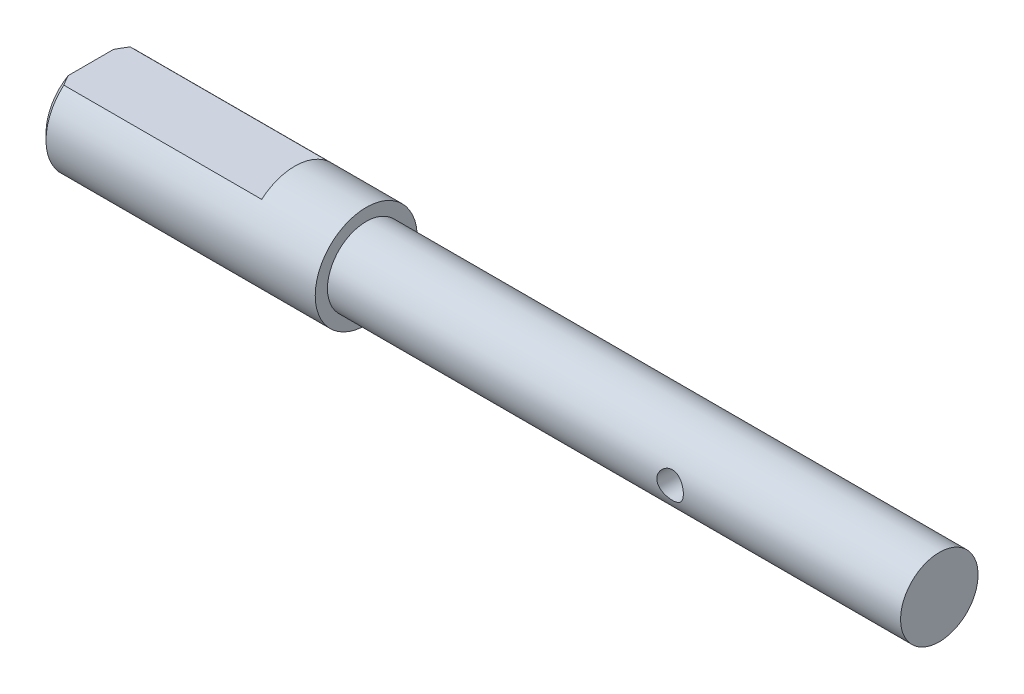
ISO-10303-21;
HEADER;
FILE_DESCRIPTION(('STEP AP214'),'2;1');
FILE_NAME('part.step','',(''),(''),'','','');
FILE_SCHEMA(('AUTOMOTIVE_DESIGN { 1 0 10303 214 1 1 1 1 }'));
ENDSEC;
DATA;
#1=APPLICATION_CONTEXT('core data for automotive mechanical design processes');
#2=APPLICATION_PROTOCOL_DEFINITION('international standard','automotive_design',2000,#1);
#3=PRODUCT_CONTEXT('',#1,'mechanical');
#4=PRODUCT('Part','Part','',(#3));
#5=PRODUCT_RELATED_PRODUCT_CATEGORY('part','',(#4));
#6=PRODUCT_DEFINITION_FORMATION('','',#4);
#7=PRODUCT_DEFINITION_CONTEXT('part definition',#1,'design');
#8=PRODUCT_DEFINITION('design','',#6,#7);
#9=PRODUCT_DEFINITION_SHAPE('','',#8);
#10=(LENGTH_UNIT() NAMED_UNIT(*) SI_UNIT(.MILLI.,.METRE.));
#11=(NAMED_UNIT(*) PLANE_ANGLE_UNIT() SI_UNIT($,.RADIAN.));
#12=(NAMED_UNIT(*) SI_UNIT($,.STERADIAN.) SOLID_ANGLE_UNIT());
#13=UNCERTAINTY_MEASURE_WITH_UNIT(LENGTH_MEASURE(1.E-05),#10,'distance_accuracy_value','');
#14=(GEOMETRIC_REPRESENTATION_CONTEXT(3) GLOBAL_UNCERTAINTY_ASSIGNED_CONTEXT((#13)) GLOBAL_UNIT_ASSIGNED_CONTEXT((#10,
#11,#12)) REPRESENTATION_CONTEXT('',''));
#15=CARTESIAN_POINT('',(0.,0.,0.));
#16=DIRECTION('',(0.,0.,1.));
#17=DIRECTION('',(1.,0.,0.));
#18=AXIS2_PLACEMENT_3D('',#15,#16,#17);
#19=CARTESIAN_POINT('',(0.,0.,0.));
#20=DIRECTION('',(-1.,0.,0.));
#21=DIRECTION('',(0.,0.,1.));
#22=AXIS2_PLACEMENT_3D('',#19,#20,#21);
#23=PLANE('',#22);
#24=CARTESIAN_POINT('',(0.,0.,0.));
#25=DIRECTION('',(-1.,0.,0.));
#26=DIRECTION('',(0.,0.,1.));
#27=AXIS2_PLACEMENT_3D('',#24,#25,#26);
#28=CIRCLE('',#27,4.826);
#29=CARTESIAN_POINT('',(0.,0.,4.826));
#30=VERTEX_POINT('',#29);
#31=EDGE_CURVE('E92',#30,#30,#28,.T.);
#32=ORIENTED_EDGE('',*,*,#31,.F.);
#33=EDGE_LOOP('',(#32));
#34=FACE_BOUND('',#33,.T.);
#35=ADVANCED_FACE('F33',(#34),#23,.F.);
#36=CARTESIAN_POINT('',(-91.2194484057398,0.,0.));
#37=DIRECTION('',(-1.,0.,0.));
#38=DIRECTION('',(0.,0.,1.));
#39=AXIS2_PLACEMENT_3D('',#36,#37,#38);
#40=CYLINDRICAL_SURFACE('',#39,4.826);
#41=CARTESIAN_POINT('',(-27.051,0.,4.826));
#42=CARTESIAN_POINT('',(-27.0509990878449,-0.089948310925937,4.82600061504766));
#43=CARTESIAN_POINT('',(-27.0583744751056,-0.179890234701643,4.82346234369505));
#44=CARTESIAN_POINT('',(-27.0875850912071,-0.357116778876718,4.81358738474251));
#45=CARTESIAN_POINT('',(-27.1094210660478,-0.444401261939741,4.80625044958703));
#46=CARTESIAN_POINT('',(-27.1667110952843,-0.61373237601587,4.78757345946431));
#47=CARTESIAN_POINT('',(-27.2021416616571,-0.695787758029834,4.77624031166481));
#48=CARTESIAN_POINT('',(-27.2855062651825,-0.852790489047824,4.75072192281067));
#49=CARTESIAN_POINT('',(-27.3334429694288,-0.92773631719387,4.73653607352901));
#50=CARTESIAN_POINT('',(-27.4422820962835,-1.07110916146627,4.7062244663646));
#51=CARTESIAN_POINT('',(-27.5035570085458,-1.13924314200904,4.69005046605606));
#52=CARTESIAN_POINT('',(-27.6365415846283,-1.26449445212582,4.65784499669713));
#53=CARTESIAN_POINT('',(-27.7082537064856,-1.32160917919808,4.64181356216832));
#54=CARTESIAN_POINT('',(-27.8627601529367,-1.42491105759758,4.61117156157241));
#55=CARTESIAN_POINT('',(-27.9458262841505,-1.47071069071595,4.59661942772964));
#56=CARTESIAN_POINT('',(-28.1190601128022,-1.54756344575182,4.57132064852932));
#57=CARTESIAN_POINT('',(-28.2092254994659,-1.57862134308965,4.56057277111275));
#58=CARTESIAN_POINT('',(-28.3907564320178,-1.62399794238702,4.54460894203585));
#59=CARTESIAN_POINT('',(-28.4819677085012,-1.63886797031299,4.53921139060835));
#60=CARTESIAN_POINT('',(-28.6657380910534,-1.65317049950624,4.53402324261601));
#61=CARTESIAN_POINT('',(-28.7582967439551,-1.65260807655792,4.53423080251107));
#62=CARTESIAN_POINT('',(-28.9373669896174,-1.63648839691122,4.5400707940568));
#63=CARTESIAN_POINT('',(-29.0239542298227,-1.62165927003447,4.54543979132206));
#64=CARTESIAN_POINT('',(-29.1933282694475,-1.57861815185369,4.56056528450964));
#65=CARTESIAN_POINT('',(-29.2761145895695,-1.55040447780873,4.57032233210131));
#66=CARTESIAN_POINT('',(-29.4371562807196,-1.48093449817667,4.59330621342633));
#67=CARTESIAN_POINT('',(-29.5153127427917,-1.43946799410487,4.60658833771117));
#68=CARTESIAN_POINT('',(-29.6637844180559,-1.34481540966014,4.6351036028836));
#69=CARTESIAN_POINT('',(-29.7340972613822,-1.29162580164328,4.65033733045655));
#70=CARTESIAN_POINT('',(-29.8689656142098,-1.17157328163229,4.6820666750574));
#71=CARTESIAN_POINT('',(-29.9329893166624,-1.1041178148428,4.69858553817464));
#72=CARTESIAN_POINT('',(-30.048958533735,-0.959226286541978,4.73029112439364));
#73=CARTESIAN_POINT('',(-30.1009027630036,-0.881789164265023,4.74547770562309));
#74=CARTESIAN_POINT('',(-30.1916974357047,-0.717958890187942,4.77302589336304));
#75=CARTESIAN_POINT('',(-30.2303984681836,-0.631477053882522,4.78535478858825));
#76=CARTESIAN_POINT('',(-30.2925355387876,-0.452706817027459,4.80556014939178));
#77=CARTESIAN_POINT('',(-30.3159771749292,-0.360420559511136,4.81343824763588));
#78=CARTESIAN_POINT('',(-30.3459718260231,-0.177158016638175,4.82358054309094));
#79=CARTESIAN_POINT('',(-30.3532429232144,-0.0863123104835725,4.82608325915506));
#80=CARTESIAN_POINT('',(-30.3527447809025,0.0953235836668608,4.82591253439317));
#81=CARTESIAN_POINT('',(-30.3449782344702,0.186113778691311,4.82324002039197));
#82=CARTESIAN_POINT('',(-30.3151894028307,0.362141478462459,4.81317669710174));
#83=CARTESIAN_POINT('',(-30.2936138184491,0.447463878135752,4.80593383153746));
#84=CARTESIAN_POINT('',(-30.2373837966749,0.613238679520882,4.78760639543958));
#85=CARTESIAN_POINT('',(-30.2027276766339,0.693690453141563,4.77652133066982));
#86=CARTESIAN_POINT('',(-30.1202852344671,0.849868179245454,4.75125571759644));
#87=CARTESIAN_POINT('',(-30.0721691419708,0.925407466689288,4.73699955710669));
#88=CARTESIAN_POINT('',(-29.964556746607,1.06756980332561,4.70700095153061));
#89=CARTESIAN_POINT('',(-29.9050568072141,1.13418999175623,4.691258032321));
#90=CARTESIAN_POINT('',(-29.7729920100712,1.25995369999455,4.65909969804483));
#91=CARTESIAN_POINT('',(-29.6999372173058,1.31858502260897,4.64268826423372));
#92=CARTESIAN_POINT('',(-29.5446776399304,1.42282719507505,4.61181134694473));
#93=CARTESIAN_POINT('',(-29.4624726584125,1.46843776465068,4.59734590535851));
#94=CARTESIAN_POINT('',(-29.2911022965889,1.54517326837327,4.57212804483025));
#95=CARTESIAN_POINT('',(-29.2019440885254,1.57631290438644,4.56137186031652));
#96=CARTESIAN_POINT('',(-29.0191923708194,1.62298264553532,4.54497823027584));
#97=CARTESIAN_POINT('',(-28.9256010249489,1.63852028529683,4.53933831409184));
#98=CARTESIAN_POINT('',(-28.7420821798439,1.6529384951282,4.53410665431848));
#99=CARTESIAN_POINT('',(-28.6522299671084,1.65267375462084,4.53420456825034));
#100=CARTESIAN_POINT('',(-28.4739226590757,1.63761572155461,4.53966446117484));
#101=CARTESIAN_POINT('',(-28.3854674723027,1.62282338428934,4.54502609404024));
#102=CARTESIAN_POINT('',(-28.2143300852495,1.57974835614155,4.56017235996656));
#103=CARTESIAN_POINT('',(-28.1315654778658,1.55175674682184,4.56986133027582));
#104=CARTESIAN_POINT('',(-27.9718461970304,1.48331722436171,4.59253082412528));
#105=CARTESIAN_POINT('',(-27.8948928600655,1.44286645663809,4.60551210186284));
#106=CARTESIAN_POINT('',(-27.7451809033666,1.34851021927541,4.63404007488274));
#107=CARTESIAN_POINT('',(-27.6727727571343,1.29407604105817,4.64967665939095));
#108=CARTESIAN_POINT('',(-27.537843087574,1.17417636692477,4.68139155639397));
#109=CARTESIAN_POINT('',(-27.4753244392811,1.10870767448248,4.69746999575438));
#110=CARTESIAN_POINT('',(-27.3593027694882,0.965308103828818,4.72906546679739));
#111=CARTESIAN_POINT('',(-27.3062869421173,0.886970153682897,4.74453079074102));
#112=CARTESIAN_POINT('',(-27.2142265932408,0.72197664784724,4.77242219831037));
#113=CARTESIAN_POINT('',(-27.1751793840624,0.635322696295829,4.78484886645178));
#114=CARTESIAN_POINT('',(-27.1132692842283,0.458546866642945,4.80496654513614));
#115=CARTESIAN_POINT('',(-27.0899965529363,0.368582563768228,4.81277674328467));
#116=CARTESIAN_POINT('',(-27.0588648029331,0.185742621781157,4.82329235134141));
#117=CARTESIAN_POINT('',(-27.0510009417623,0.0928679066329231,4.82599936498875));
#118=CARTESIAN_POINT('',(-27.051,0.,4.826));
#119=B_SPLINE_CURVE_WITH_KNOTS('',3,(#41,#42,#43,#44,#45,#46,#47,#48,#49,#50,#51,#52,#53,#54,
#55,#56,#57,#58,#59,#60,#61,#62,#63,#64,#65,#66,#67,#68,#69,#70,#71,#72,#73,#74,#75,#76,#77,#78,
#79,#80,#81,#82,#83,#84,#85,#86,#87,#88,#89,#90,#91,#92,#93,#94,#95,#96,#97,#98,#99,#100,#101,
#102,#103,#104,#105,#106,#107,#108,#109,#110,#111,#112,#113,#114,#115,#116,#117,#118),
.UNSPECIFIED.,.T.,.F.,(4,2,2,2,2,2,2,2,2,2,2,2,2,2,2,2,2,2,2,2,2,2,2,2,2,2,2,2,2,2,2,2,2,2,2,2,
2,2,4),(0.,0.269503016147321,0.539019936630532,0.80807328158337,1.07718405257586,
1.35508842028342,1.6330583426685,1.91952748427716,2.20590376397331,2.48218802140442,
2.75838140911425,3.02118753986466,3.28402672006198,3.55126085495383,3.81857551434541,
4.10064112158837,4.38273672912147,4.66791743303494,4.95299345735877,5.22513367779232,
5.49722516551677,5.76093150032747,6.0246717692468,6.29554519017895,6.56650528548132,
6.85046803103149,7.13443688851284,7.41811661130837,7.70165927151467,7.96988087121881,
8.23808483461142,8.50063255599857,8.76324047587522,9.03780411918807,9.31244743642614,
9.59859216196641,9.88468180134445,10.1630199923053,10.4412706974405),.UNSPECIFIED.);
#120=CARTESIAN_POINT('',(-27.051,0.,4.826));
#121=VERTEX_POINT('',#120);
#122=EDGE_CURVE('E89',#121,#121,#119,.T.);
#123=ORIENTED_EDGE('',*,*,#122,.T.);
#124=EDGE_LOOP('',(#123));
#125=FACE_BOUND('',#124,.T.);
#126=CARTESIAN_POINT('',(-27.051,0.,-4.826));
#127=CARTESIAN_POINT('',(-27.0509990878449,0.0899483109259372,-4.82600061504766));
#128=CARTESIAN_POINT('',(-27.0583744751056,0.179890234701644,-4.82346234369505));
#129=CARTESIAN_POINT('',(-27.0875850912071,0.357116778876719,-4.81358738474251));
#130=CARTESIAN_POINT('',(-27.1094210660478,0.444401261939741,-4.80625044958703));
#131=CARTESIAN_POINT('',(-27.1667110952843,0.61373237601587,-4.78757345946431));
#132=CARTESIAN_POINT('',(-27.2021416616571,0.695787758029834,-4.77624031166481));
#133=CARTESIAN_POINT('',(-27.2855062651825,0.852790489047824,-4.75072192281067));
#134=CARTESIAN_POINT('',(-27.3334429694288,0.92773631719387,-4.73653607352901));
#135=CARTESIAN_POINT('',(-27.4422820962835,1.07110916146627,-4.7062244663646));
#136=CARTESIAN_POINT('',(-27.5035570085458,1.13924314200904,-4.69005046605606));
#137=CARTESIAN_POINT('',(-27.6365415846283,1.26449445212582,-4.65784499669713));
#138=CARTESIAN_POINT('',(-27.7082537064856,1.32160917919808,-4.64181356216832));
#139=CARTESIAN_POINT('',(-27.8627601529367,1.42491105759757,-4.61117156157241));
#140=CARTESIAN_POINT('',(-27.9458262841505,1.47071069071595,-4.59661942772964));
#141=CARTESIAN_POINT('',(-28.1190601128022,1.54756344575182,-4.57132064852932));
#142=CARTESIAN_POINT('',(-28.2092254994659,1.57862134308965,-4.56057277111275));
#143=CARTESIAN_POINT('',(-28.3907564320178,1.62399794238702,-4.54460894203585));
#144=CARTESIAN_POINT('',(-28.4819677085012,1.63886797031299,-4.53921139060835));
#145=CARTESIAN_POINT('',(-28.6657380910534,1.65317049950624,-4.53402324261601));
#146=CARTESIAN_POINT('',(-28.7582967439551,1.65260807655792,-4.53423080251107));
#147=CARTESIAN_POINT('',(-28.9373669896174,1.63648839691122,-4.5400707940568));
#148=CARTESIAN_POINT('',(-29.0239542298227,1.62165927003447,-4.54543979132206));
#149=CARTESIAN_POINT('',(-29.1933282694475,1.57861815185369,-4.56056528450964));
#150=CARTESIAN_POINT('',(-29.2761145895695,1.55040447780873,-4.57032233210131));
#151=CARTESIAN_POINT('',(-29.4371562807196,1.48093449817667,-4.59330621342633));
#152=CARTESIAN_POINT('',(-29.5153127427917,1.43946799410487,-4.60658833771117));
#153=CARTESIAN_POINT('',(-29.6637844180559,1.34481540966014,-4.6351036028836));
#154=CARTESIAN_POINT('',(-29.7340972613822,1.29162580164328,-4.65033733045655));
#155=CARTESIAN_POINT('',(-29.8689656142098,1.17157328163229,-4.6820666750574));
#156=CARTESIAN_POINT('',(-29.9329893166624,1.1041178148428,-4.69858553817464));
#157=CARTESIAN_POINT('',(-30.048958533735,0.959226286541979,-4.73029112439364));
#158=CARTESIAN_POINT('',(-30.1009027630036,0.881789164265023,-4.74547770562309));
#159=CARTESIAN_POINT('',(-30.1916974357047,0.717958890187942,-4.77302589336304));
#160=CARTESIAN_POINT('',(-30.2303984681836,0.631477053882522,-4.78535478858825));
#161=CARTESIAN_POINT('',(-30.2925355387876,0.452706817027459,-4.80556014939178));
#162=CARTESIAN_POINT('',(-30.3159771749292,0.360420559511136,-4.81343824763588));
#163=CARTESIAN_POINT('',(-30.3459718260231,0.177158016638176,-4.82358054309094));
#164=CARTESIAN_POINT('',(-30.3532429232144,0.0863123104835731,-4.82608325915506));
#165=CARTESIAN_POINT('',(-30.3527447809025,-0.0953235836668603,-4.82591253439317));
#166=CARTESIAN_POINT('',(-30.3449782344702,-0.186113778691311,-4.82324002039197));
#167=CARTESIAN_POINT('',(-30.3151894028307,-0.362141478462458,-4.81317669710174));
#168=CARTESIAN_POINT('',(-30.2936138184491,-0.44746387813575,-4.80593383153746));
#169=CARTESIAN_POINT('',(-30.2373837966749,-0.61323867952088,-4.78760639543958));
#170=CARTESIAN_POINT('',(-30.2027276766339,-0.693690453141562,-4.77652133066982));
#171=CARTESIAN_POINT('',(-30.1202852344671,-0.849868179245455,-4.75125571759644));
#172=CARTESIAN_POINT('',(-30.0721691419708,-0.925407466689288,-4.73699955710669));
#173=CARTESIAN_POINT('',(-29.964556746607,-1.06756980332561,-4.70700095153061));
#174=CARTESIAN_POINT('',(-29.9050568072141,-1.13418999175623,-4.691258032321));
#175=CARTESIAN_POINT('',(-29.7729920100712,-1.25995369999455,-4.65909969804483));
#176=CARTESIAN_POINT('',(-29.6999372173058,-1.31858502260898,-4.64268826423372));
#177=CARTESIAN_POINT('',(-29.5446776399304,-1.42282719507505,-4.61181134694473));
#178=CARTESIAN_POINT('',(-29.4624726584125,-1.46843776465068,-4.59734590535851));
#179=CARTESIAN_POINT('',(-29.2911022965889,-1.54517326837327,-4.57212804483025));
#180=CARTESIAN_POINT('',(-29.2019440885254,-1.57631290438644,-4.56137186031652));
#181=CARTESIAN_POINT('',(-29.0191923708194,-1.62298264553532,-4.54497823027584));
#182=CARTESIAN_POINT('',(-28.9256010249489,-1.63852028529683,-4.53933831409184));
#183=CARTESIAN_POINT('',(-28.7420821798439,-1.6529384951282,-4.53410665431848));
#184=CARTESIAN_POINT('',(-28.6522299671084,-1.65267375462084,-4.53420456825034));
#185=CARTESIAN_POINT('',(-28.4739226590757,-1.63761572155461,-4.53966446117484));
#186=CARTESIAN_POINT('',(-28.3854674723027,-1.62282338428934,-4.54502609404024));
#187=CARTESIAN_POINT('',(-28.2143300852495,-1.57974835614155,-4.56017235996656));
#188=CARTESIAN_POINT('',(-28.1315654778658,-1.55175674682184,-4.56986133027582));
#189=CARTESIAN_POINT('',(-27.9718461970304,-1.48331722436171,-4.59253082412528));
#190=CARTESIAN_POINT('',(-27.8948928600655,-1.44286645663809,-4.60551210186284));
#191=CARTESIAN_POINT('',(-27.7451809033666,-1.34851021927541,-4.63404007488274));
#192=CARTESIAN_POINT('',(-27.6727727571343,-1.29407604105817,-4.64967665939095));
#193=CARTESIAN_POINT('',(-27.537843087574,-1.17417636692477,-4.68139155639397));
#194=CARTESIAN_POINT('',(-27.4753244392811,-1.10870767448248,-4.69746999575438));
#195=CARTESIAN_POINT('',(-27.3593027694882,-0.965308103828818,-4.72906546679739));
#196=CARTESIAN_POINT('',(-27.3062869421173,-0.886970153682897,-4.74453079074102));
#197=CARTESIAN_POINT('',(-27.2142265932408,-0.72197664784724,-4.77242219831037));
#198=CARTESIAN_POINT('',(-27.1751793840624,-0.635322696295829,-4.78484886645178));
#199=CARTESIAN_POINT('',(-27.1132692842283,-0.458546866642945,-4.80496654513614));
#200=CARTESIAN_POINT('',(-27.0899965529363,-0.368582563768228,-4.81277674328467));
#201=CARTESIAN_POINT('',(-27.0588648029331,-0.185742621781157,-4.82329235134141));
#202=CARTESIAN_POINT('',(-27.0510009417623,-0.0928679066329231,-4.82599936498875));
#203=CARTESIAN_POINT('',(-27.051,0.,-4.826));
#204=B_SPLINE_CURVE_WITH_KNOTS('',3,(#126,#127,#128,#129,#130,#131,#132,#133,#134,#135,#136,
#137,#138,#139,#140,#141,#142,#143,#144,#145,#146,#147,#148,#149,#150,#151,#152,#153,#154,#155,
#156,#157,#158,#159,#160,#161,#162,#163,#164,#165,#166,#167,#168,#169,#170,#171,#172,#173,#174,
#175,#176,#177,#178,#179,#180,#181,#182,#183,#184,#185,#186,#187,#188,#189,#190,#191,#192,#193,
#194,#195,#196,#197,#198,#199,#200,#201,#202,#203),.UNSPECIFIED.,.T.,.F.,(4,2,2,2,2,2,2,2,2,2,2,
2,2,2,2,2,2,2,2,2,2,2,2,2,2,2,2,2,2,2,2,2,2,2,2,2,2,2,4),(0.,0.269503016147322,
0.539019936630532,0.80807328158337,1.07718405257586,1.35508842028342,1.6330583426685,
1.91952748427716,2.20590376397331,2.48218802140442,2.75838140911425,3.02118753986466,
3.28402672006198,3.55126085495383,3.81857551434541,4.10064112158837,4.38273672912147,
4.66791743303495,4.95299345735877,5.22513367779232,5.49722516551677,5.76093150032747,
6.0246717692468,6.29554519017895,6.56650528548132,6.85046803103149,7.13443688851284,
7.41811661130837,7.70165927151467,7.96988087121881,8.23808483461142,8.50063255599857,
8.76324047587522,9.03780411918807,9.31244743642614,9.59859216196641,9.88468180134445,
10.1630199923053,10.4412706974405),.UNSPECIFIED.);
#205=CARTESIAN_POINT('',(-27.051,0.,-4.826));
#206=VERTEX_POINT('',#205);
#207=EDGE_CURVE('E81',#206,#206,#204,.T.);
#208=ORIENTED_EDGE('',*,*,#207,.T.);
#209=EDGE_LOOP('',(#208));
#210=FACE_BOUND('',#209,.T.);
#211=CARTESIAN_POINT('',(-71.374,0.,0.));
#212=DIRECTION('',(-1.,0.,0.));
#213=DIRECTION('',(0.,0.,1.));
#214=AXIS2_PLACEMENT_3D('',#211,#212,#213);
#215=CIRCLE('',#214,4.82599999999999);
#216=CARTESIAN_POINT('',(-71.374,0.,4.82599999999999));
#217=VERTEX_POINT('',#216);
#218=EDGE_CURVE('E88',#217,#217,#215,.T.);
#219=ORIENTED_EDGE('',*,*,#218,.F.);
#220=EDGE_LOOP('',(#219));
#221=FACE_BOUND('',#220,.T.);
#222=ORIENTED_EDGE('',*,*,#31,.T.);
#223=EDGE_LOOP('',(#222));
#224=FACE_BOUND('',#223,.T.);
#225=ADVANCED_FACE('F105',(#125,#210,#221,#224),#40,.T.);
#226=CARTESIAN_POINT('',(-71.374,4.82599999999999,0.));
#227=DIRECTION('',(-1.,0.,0.));
#228=DIRECTION('',(0.,0.,1.));
#229=AXIS2_PLACEMENT_3D('',#226,#227,#228);
#230=PLANE('',#229);
#231=CARTESIAN_POINT('',(-71.374,0.,0.));
#232=DIRECTION('',(-1.,0.,0.));
#233=DIRECTION('',(0.,0.,1.));
#234=AXIS2_PLACEMENT_3D('',#231,#232,#233);
#235=CIRCLE('',#234,6.34999999999999);
#236=CARTESIAN_POINT('',(-71.374,0.,6.34999999999999));
#237=VERTEX_POINT('',#236);
#238=EDGE_CURVE('E85',#237,#237,#235,.T.);
#239=ORIENTED_EDGE('',*,*,#238,.F.);
#240=EDGE_LOOP('',(#239));
#241=FACE_BOUND('',#240,.T.);
#242=ORIENTED_EDGE('',*,*,#218,.T.);
#243=EDGE_LOOP('',(#242));
#244=FACE_BOUND('',#243,.T.);
#245=ADVANCED_FACE('F122',(#241,#244),#230,.F.);
#246=CARTESIAN_POINT('',(-91.2194484057398,0.,0.));
#247=DIRECTION('',(-1.,0.,0.));
#248=DIRECTION('',(0.,0.,1.));
#249=AXIS2_PLACEMENT_3D('',#246,#247,#248);
#250=CYLINDRICAL_SURFACE('',#249,6.34999999999999);
#251=DIRECTION('',(-1.,0.,0.));
#252=VECTOR('',#251,1.);
#253=CARTESIAN_POINT('',(-80.264,4.82599999999999,4.12701150955507));
#254=LINE('',#253,#252);
#255=CARTESIAN_POINT('',(-80.264,4.82599999999999,4.12701150955507));
#256=VERTEX_POINT('',#255);
#257=CARTESIAN_POINT('',(-104.902,4.82599999999999,4.12701150955507));
#258=VERTEX_POINT('',#257);
#259=EDGE_CURVE('E76',#256,#258,#254,.T.);
#260=ORIENTED_EDGE('',*,*,#259,.T.);
#261=CARTESIAN_POINT('',(-104.902,0.,0.));
#262=DIRECTION('',(1.,0.,0.));
#263=DIRECTION('',(0.,0.,-1.));
#264=AXIS2_PLACEMENT_3D('',#261,#262,#263);
#265=CIRCLE('',#264,6.34999999999999);
#266=CARTESIAN_POINT('',(-104.902,4.82599999999999,-4.12701150955507));
#267=VERTEX_POINT('',#266);
#268=EDGE_CURVE('E11',#258,#267,#265,.T.);
#269=ORIENTED_EDGE('',*,*,#268,.T.);
#270=DIRECTION('',(-1.,0.,0.));
#271=VECTOR('',#270,1.);
#272=CARTESIAN_POINT('',(-80.264,4.82599999999999,-4.12701150955507));
#273=LINE('',#272,#271);
#274=CARTESIAN_POINT('',(-80.264,4.82599999999999,-4.12701150955507));
#275=VERTEX_POINT('',#274);
#276=EDGE_CURVE('E74',#275,#267,#273,.T.);
#277=ORIENTED_EDGE('',*,*,#276,.F.);
#278=CARTESIAN_POINT('',(-80.264,0.,0.));
#279=DIRECTION('',(-1.,0.,0.));
#280=DIRECTION('',(0.,0.,1.));
#281=AXIS2_PLACEMENT_3D('',#278,#279,#280);
#282=CIRCLE('',#281,6.34999999999999);
#283=EDGE_CURVE('E67',#256,#275,#282,.T.);
#284=ORIENTED_EDGE('',*,*,#283,.F.);
#285=EDGE_LOOP('',(#260,#269,#277,#284));
#286=FACE_BOUND('',#285,.T.);
#287=ORIENTED_EDGE('',*,*,#238,.T.);
#288=EDGE_LOOP('',(#287));
#289=FACE_BOUND('',#288,.T.);
#290=ADVANCED_FACE('F78',(#286,#289),#250,.T.);
#291=CARTESIAN_POINT('',(-105.664,6.34999999999999,0.));
#292=DIRECTION('',(1.,0.,0.));
#293=DIRECTION('',(0.,0.,-1.));
#294=AXIS2_PLACEMENT_3D('',#291,#292,#293);
#295=PLANE('',#294);
#296=DIRECTION('',(0.,0.,1.));
#297=VECTOR('',#296,1.);
#298=CARTESIAN_POINT('',(-105.664,4.82599999999999,-4.12701150955507));
#299=LINE('',#298,#297);
#300=CARTESIAN_POINT('',(-105.664,4.82599999999999,-2.816996272628));
#301=VERTEX_POINT('',#300);
#302=CARTESIAN_POINT('',(-105.664,4.82599999999999,2.816996272628));
#303=VERTEX_POINT('',#302);
#304=EDGE_CURVE('E71',#301,#303,#299,.T.);
#305=ORIENTED_EDGE('',*,*,#304,.F.);
#306=CARTESIAN_POINT('',(-105.664,0.,0.));
#307=DIRECTION('',(1.,0.,0.));
#308=DIRECTION('',(0.,0.,-1.));
#309=AXIS2_PLACEMENT_3D('',#306,#307,#308);
#310=CIRCLE('',#309,5.588);
#311=EDGE_CURVE('E95',#301,#303,#310,.F.);
#312=ORIENTED_EDGE('',*,*,#311,.T.);
#313=EDGE_LOOP('',(#305,#312));
#314=FACE_BOUND('',#313,.T.);
#315=ADVANCED_FACE('F113',(#314),#295,.F.);
#316=CARTESIAN_POINT('',(-28.702,0.,-6.34999999999999));
#317=DIRECTION('',(0.,0.,1.));
#318=DIRECTION('',(1.,0.,0.));
#319=AXIS2_PLACEMENT_3D('',#316,#317,#318);
#320=CYLINDRICAL_SURFACE('',#319,1.651);
#321=ORIENTED_EDGE('',*,*,#207,.F.);
#322=EDGE_LOOP('',(#321));
#323=FACE_BOUND('',#322,.T.);
#324=ORIENTED_EDGE('',*,*,#122,.F.);
#325=EDGE_LOOP('',(#324));
#326=FACE_BOUND('',#325,.T.);
#327=ADVANCED_FACE('F108',(#323,#326),#320,.F.);
#328=CARTESIAN_POINT('',(-80.264,4.82599999999999,-4.12701150955507));
#329=DIRECTION('',(0.,-1.,0.));
#330=DIRECTION('',(0.,0.,-1.));
#331=AXIS2_PLACEMENT_3D('',#328,#329,#330);
#332=PLANE('',#331);
#333=ORIENTED_EDGE('',*,*,#304,.T.);
#334=CARTESIAN_POINT('',(-105.664,4.82599999999999,2.816996272628));
#335=CARTESIAN_POINT('',(-105.607077370759,4.82599999999999,2.9298795753712));
#336=CARTESIAN_POINT('',(-105.548155400272,4.82599999999999,3.04173333712821));
#337=CARTESIAN_POINT('',(-105.426894811659,4.82599999999999,3.26346920920019));
#338=CARTESIAN_POINT('',(-105.364558750267,4.82599999999999,3.373352715301));
#339=CARTESIAN_POINT('',(-105.236975689661,4.82599999999999,3.59138578732534));
#340=CARTESIAN_POINT('',(-105.171729119983,4.82599999999999,3.69953560592659));
#341=CARTESIAN_POINT('',(-105.038674337462,4.82599999999999,3.91436036766789));
#342=CARTESIAN_POINT('',(-104.970864268222,4.82599999999999,4.0210341624914));
#343=CARTESIAN_POINT('',(-104.902,4.82599999999999,4.12701150955507));
#344=B_SPLINE_CURVE_WITH_KNOTS('',3,(#334,#335,#336,#337,#338,#339,#340,#341,#342,#343),
.UNSPECIFIED.,.F.,.F.,(4,2,2,2,4),(0.,0.379222255168282,0.758164302643616,1.13705060934397,
1.51621675557459),.UNSPECIFIED.);
#345=EDGE_CURVE('E42',#303,#258,#344,.T.);
#346=ORIENTED_EDGE('',*,*,#345,.T.);
#347=ORIENTED_EDGE('',*,*,#259,.F.);
#348=DIRECTION('',(0.,0.,1.));
#349=VECTOR('',#348,1.);
#350=CARTESIAN_POINT('',(-80.264,4.82599999999999,-4.12701150955507));
#351=LINE('',#350,#349);
#352=EDGE_CURVE('E70',#275,#256,#351,.T.);
#353=ORIENTED_EDGE('',*,*,#352,.F.);
#354=ORIENTED_EDGE('',*,*,#276,.T.);
#355=CARTESIAN_POINT('',(-104.902,4.82599999999999,-4.12701150955507));
#356=CARTESIAN_POINT('',(-104.970864268222,4.82599999999999,-4.0210341624914));
#357=CARTESIAN_POINT('',(-105.038674337462,4.82599999999999,-3.91436036766789));
#358=CARTESIAN_POINT('',(-105.171729119983,4.82599999999999,-3.69953560592658));
#359=CARTESIAN_POINT('',(-105.236975689661,4.82599999999999,-3.59138578732534));
#360=CARTESIAN_POINT('',(-105.364558750267,4.82599999999999,-3.37335271530099));
#361=CARTESIAN_POINT('',(-105.426894811659,4.82599999999999,-3.26346920920018));
#362=CARTESIAN_POINT('',(-105.548155400272,4.82599999999999,-3.04173333712821));
#363=CARTESIAN_POINT('',(-105.607077370759,4.82599999999999,-2.9298795753712));
#364=CARTESIAN_POINT('',(-105.664,4.82599999999999,-2.816996272628));
#365=B_SPLINE_CURVE_WITH_KNOTS('',3,(#355,#356,#357,#358,#359,#360,#361,#362,#363,#364),
.UNSPECIFIED.,.F.,.F.,(4,2,2,2,4),(0.,0.379166146230632,0.758052452930981,1.13699450040631,
1.51621675557459),.UNSPECIFIED.);
#366=EDGE_CURVE('E188',#267,#301,#365,.T.);
#367=ORIENTED_EDGE('',*,*,#366,.T.);
#368=EDGE_LOOP('',(#333,#346,#347,#353,#354,#367));
#369=FACE_BOUND('',#368,.T.);
#370=ADVANCED_FACE('F73',(#369),#332,.F.);
#371=CARTESIAN_POINT('',(-80.264,0.,0.));
#372=DIRECTION('',(-1.,0.,0.));
#373=DIRECTION('',(0.,0.,1.));
#374=AXIS2_PLACEMENT_3D('',#371,#372,#373);
#375=PLANE('',#374);
#376=ORIENTED_EDGE('',*,*,#283,.T.);
#377=ORIENTED_EDGE('',*,*,#352,.T.);
#378=EDGE_LOOP('',(#376,#377));
#379=FACE_BOUND('',#378,.T.);
#380=ADVANCED_FACE('F69',(#379),#375,.T.);
#381=CARTESIAN_POINT('',(-105.664,0.,0.));
#382=DIRECTION('',(1.,0.,0.));
#383=DIRECTION('',(0.,0.,-1.));
#384=AXIS2_PLACEMENT_3D('',#381,#382,#383);
#385=CONICAL_SURFACE('',#384,5.588,0.785398163397456);
#386=ORIENTED_EDGE('',*,*,#366,.F.);
#387=ORIENTED_EDGE('',*,*,#268,.F.);
#388=ORIENTED_EDGE('',*,*,#345,.F.);
#389=ORIENTED_EDGE('',*,*,#311,.F.);
#390=EDGE_LOOP('',(#386,#387,#388,#389));
#391=FACE_BOUND('',#390,.T.);
#392=ADVANCED_FACE('F35',(#391),#385,.T.);
#393=CLOSED_SHELL('',(#35,#225,#245,#290,#315,#327,#370,#380,#392));
#394=MANIFOLD_SOLID_BREP('B2',#393);
#395=ADVANCED_BREP_SHAPE_REPRESENTATION('',(#18,#394),#14);
#396=SHAPE_DEFINITION_REPRESENTATION(#9,#395);
ENDSEC;
END-ISO-10303-21;
